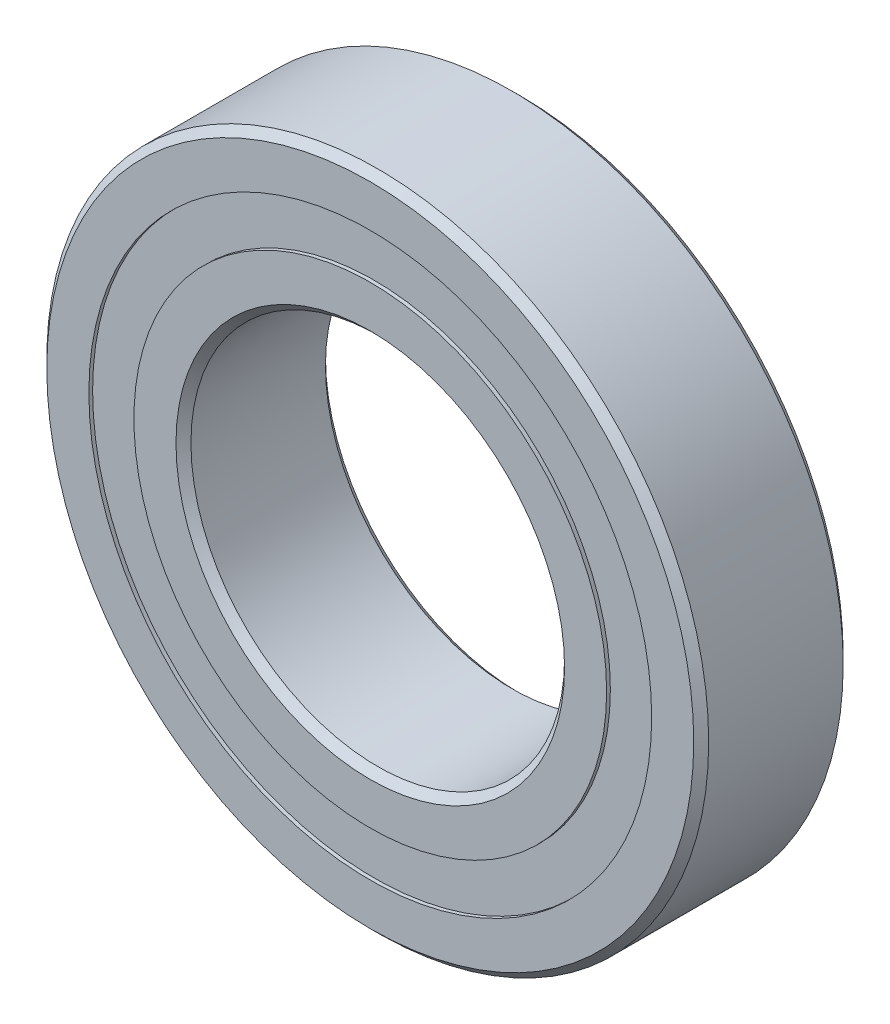
ISO-10303-21;
HEADER;
FILE_DESCRIPTION(('STEP AP214'),'2;1');
FILE_NAME('part.step','',(''),(''),'','','');
FILE_SCHEMA(('AUTOMOTIVE_DESIGN { 1 0 10303 214 1 1 1 1 }'));
ENDSEC;
DATA;
#1=APPLICATION_CONTEXT('core data for automotive mechanical design processes');
#2=APPLICATION_PROTOCOL_DEFINITION('international standard','automotive_design',2000,#1);
#3=PRODUCT_CONTEXT('',#1,'mechanical');
#4=PRODUCT('Part','Part','',(#3));
#5=PRODUCT_RELATED_PRODUCT_CATEGORY('part','',(#4));
#6=PRODUCT_DEFINITION_FORMATION('','',#4);
#7=PRODUCT_DEFINITION_CONTEXT('part definition',#1,'design');
#8=PRODUCT_DEFINITION('design','',#6,#7);
#9=PRODUCT_DEFINITION_SHAPE('','',#8);
#10=(LENGTH_UNIT() NAMED_UNIT(*) SI_UNIT(.MILLI.,.METRE.));
#11=(NAMED_UNIT(*) PLANE_ANGLE_UNIT() SI_UNIT($,.RADIAN.));
#12=(NAMED_UNIT(*) SI_UNIT($,.STERADIAN.) SOLID_ANGLE_UNIT());
#13=UNCERTAINTY_MEASURE_WITH_UNIT(LENGTH_MEASURE(1.E-05),#10,'distance_accuracy_value','');
#14=(GEOMETRIC_REPRESENTATION_CONTEXT(3) GLOBAL_UNCERTAINTY_ASSIGNED_CONTEXT((#13)) GLOBAL_UNIT_ASSIGNED_CONTEXT((#10,
#11,#12)) REPRESENTATION_CONTEXT('',''));
#15=CARTESIAN_POINT('',(0.,0.,0.));
#16=DIRECTION('',(0.,0.,1.));
#17=DIRECTION('',(1.,0.,0.));
#18=AXIS2_PLACEMENT_3D('',#15,#16,#17);
#19=CARTESIAN_POINT('',(0.,26.3596401098901,-6.65000000000001));
#20=DIRECTION('',(0.,0.,1.));
#21=DIRECTION('',(1.,0.,0.));
#22=AXIS2_PLACEMENT_3D('',#19,#20,#21);
#23=PLANE('',#22);
#24=CARTESIAN_POINT('',(0.,0.,-6.65000000000001));
#25=DIRECTION('',(0.,0.,1.));
#26=DIRECTION('',(1.,0.,0.));
#27=AXIS2_PLACEMENT_3D('',#24,#25,#26);
#28=CIRCLE('',#27,26.3596401098901);
#29=CARTESIAN_POINT('',(26.3596401098901,0.,-6.65000000000001));
#30=VERTEX_POINT('',#29);
#31=EDGE_CURVE('E60',#30,#30,#28,.T.);
#32=ORIENTED_EDGE('',*,*,#31,.F.);
#33=EDGE_LOOP('',(#32));
#34=FACE_BOUND('',#33,.T.);
#35=CARTESIAN_POINT('',(0.,0.,-6.65000000000001));
#36=DIRECTION('',(0.,0.,1.));
#37=DIRECTION('',(1.,0.,0.));
#38=AXIS2_PLACEMENT_3D('',#35,#36,#37);
#39=CIRCLE('',#38,22.1398598901099);
#40=CARTESIAN_POINT('',(22.1398598901099,0.,-6.65000000000001));
#41=VERTEX_POINT('',#40);
#42=EDGE_CURVE('E11',#41,#41,#39,.T.);
#43=ORIENTED_EDGE('',*,*,#42,.T.);
#44=EDGE_LOOP('',(#43));
#45=FACE_BOUND('',#44,.T.);
#46=ADVANCED_FACE('F46',(#34,#45),#23,.F.);
#47=CARTESIAN_POINT('',(0.,0.,7.));
#48=DIRECTION('',(0.,0.,1.));
#49=DIRECTION('',(1.,0.,0.));
#50=AXIS2_PLACEMENT_3D('',#47,#48,#49);
#51=CYLINDRICAL_SURFACE('',#50,22.1398598901099);
#52=ORIENTED_EDGE('',*,*,#42,.F.);
#53=EDGE_LOOP('',(#52));
#54=FACE_BOUND('',#53,.T.);
#55=CARTESIAN_POINT('',(0.,0.,-3.75907550090326));
#56=DIRECTION('',(0.,0.,1.));
#57=DIRECTION('',(1.,0.,0.));
#58=AXIS2_PLACEMENT_3D('',#55,#56,#57);
#59=CIRCLE('',#58,22.1398598901099);
#60=CARTESIAN_POINT('',(22.1398598901099,0.,-3.75907550090326));
#61=VERTEX_POINT('',#60);
#62=EDGE_CURVE('E52',#61,#61,#59,.T.);
#63=ORIENTED_EDGE('',*,*,#62,.T.);
#64=EDGE_LOOP('',(#63));
#65=FACE_BOUND('',#64,.T.);
#66=ADVANCED_FACE('F69',(#54,#65),#51,.F.);
#67=CARTESIAN_POINT('',(0.,26.3596401098901,-3.75907550090326));
#68=DIRECTION('',(0.,0.,-1.));
#69=DIRECTION('',(-1.,0.,0.));
#70=AXIS2_PLACEMENT_3D('',#67,#68,#69);
#71=PLANE('',#70);
#72=ORIENTED_EDGE('',*,*,#62,.F.);
#73=EDGE_LOOP('',(#72));
#74=FACE_BOUND('',#73,.T.);
#75=CARTESIAN_POINT('',(0.,0.,-3.75907550090326));
#76=DIRECTION('',(0.,0.,1.));
#77=DIRECTION('',(1.,0.,0.));
#78=AXIS2_PLACEMENT_3D('',#75,#76,#77);
#79=CIRCLE('',#78,26.3596401098901);
#80=CARTESIAN_POINT('',(26.3596401098901,0.,-3.75907550090326));
#81=VERTEX_POINT('',#80);
#82=EDGE_CURVE('E56',#81,#81,#79,.T.);
#83=ORIENTED_EDGE('',*,*,#82,.T.);
#84=EDGE_LOOP('',(#83));
#85=FACE_BOUND('',#84,.T.);
#86=ADVANCED_FACE('F73',(#74,#85),#71,.F.);
#87=CARTESIAN_POINT('',(0.,0.,7.));
#88=DIRECTION('',(0.,0.,1.));
#89=DIRECTION('',(1.,0.,0.));
#90=AXIS2_PLACEMENT_3D('',#87,#88,#89);
#91=CYLINDRICAL_SURFACE('',#90,26.3596401098901);
#92=ORIENTED_EDGE('',*,*,#82,.F.);
#93=EDGE_LOOP('',(#92));
#94=FACE_BOUND('',#93,.T.);
#95=ORIENTED_EDGE('',*,*,#31,.T.);
#96=EDGE_LOOP('',(#95));
#97=FACE_BOUND('',#96,.T.);
#98=ADVANCED_FACE('F66',(#94,#97),#91,.T.);
#99=CLOSED_SHELL('',(#46,#66,#86,#98));
#100=MANIFOLD_SOLID_BREP('B2',#99);
#101=CARTESIAN_POINT('',(0.,26.3596401098901,6.65));
#102=DIRECTION('',(0.,0.,-1.));
#103=DIRECTION('',(-1.,0.,0.));
#104=AXIS2_PLACEMENT_3D('',#101,#102,#103);
#105=PLANE('',#104);
#106=CARTESIAN_POINT('',(0.,0.,6.65));
#107=DIRECTION('',(0.,0.,1.));
#108=DIRECTION('',(1.,0.,0.));
#109=AXIS2_PLACEMENT_3D('',#106,#107,#108);
#110=CIRCLE('',#109,22.1398598901099);
#111=CARTESIAN_POINT('',(22.1398598901099,0.,6.65));
#112=VERTEX_POINT('',#111);
#113=EDGE_CURVE('E45',#112,#112,#110,.T.);
#114=ORIENTED_EDGE('',*,*,#113,.F.);
#115=EDGE_LOOP('',(#114));
#116=FACE_BOUND('',#115,.T.);
#117=CARTESIAN_POINT('',(0.,0.,6.65));
#118=DIRECTION('',(0.,0.,1.));
#119=DIRECTION('',(1.,0.,0.));
#120=AXIS2_PLACEMENT_3D('',#117,#118,#119);
#121=CIRCLE('',#120,26.3596401098901);
#122=CARTESIAN_POINT('',(26.3596401098901,0.,6.65));
#123=VERTEX_POINT('',#122);
#124=EDGE_CURVE('E128',#123,#123,#121,.T.);
#125=ORIENTED_EDGE('',*,*,#124,.T.);
#126=EDGE_LOOP('',(#125));
#127=FACE_BOUND('',#126,.T.);
#128=ADVANCED_FACE('F114',(#116,#127),#105,.F.);
#129=CARTESIAN_POINT('',(0.,0.,7.));
#130=DIRECTION('',(0.,0.,1.));
#131=DIRECTION('',(1.,0.,0.));
#132=AXIS2_PLACEMENT_3D('',#129,#130,#131);
#133=CYLINDRICAL_SURFACE('',#132,22.1398598901099);
#134=CARTESIAN_POINT('',(0.,0.,3.75907550090326));
#135=DIRECTION('',(0.,0.,1.));
#136=DIRECTION('',(1.,0.,0.));
#137=AXIS2_PLACEMENT_3D('',#134,#135,#136);
#138=CIRCLE('',#137,22.1398598901099);
#139=CARTESIAN_POINT('',(22.1398598901099,0.,3.75907550090326));
#140=VERTEX_POINT('',#139);
#141=EDGE_CURVE('E120',#140,#140,#138,.T.);
#142=ORIENTED_EDGE('',*,*,#141,.F.);
#143=EDGE_LOOP('',(#142));
#144=FACE_BOUND('',#143,.T.);
#145=ORIENTED_EDGE('',*,*,#113,.T.);
#146=EDGE_LOOP('',(#145));
#147=FACE_BOUND('',#146,.T.);
#148=ADVANCED_FACE('F143',(#144,#147),#133,.F.);
#149=CARTESIAN_POINT('',(0.,26.3596401098901,3.75907550090326));
#150=DIRECTION('',(0.,0.,1.));
#151=DIRECTION('',(1.,0.,0.));
#152=AXIS2_PLACEMENT_3D('',#149,#150,#151);
#153=PLANE('',#152);
#154=CARTESIAN_POINT('',(0.,0.,3.75907550090326));
#155=DIRECTION('',(0.,0.,1.));
#156=DIRECTION('',(1.,0.,0.));
#157=AXIS2_PLACEMENT_3D('',#154,#155,#156);
#158=CIRCLE('',#157,26.3596401098901);
#159=CARTESIAN_POINT('',(26.3596401098901,0.,3.75907550090326));
#160=VERTEX_POINT('',#159);
#161=EDGE_CURVE('E124',#160,#160,#158,.T.);
#162=ORIENTED_EDGE('',*,*,#161,.F.);
#163=EDGE_LOOP('',(#162));
#164=FACE_BOUND('',#163,.T.);
#165=ORIENTED_EDGE('',*,*,#141,.T.);
#166=EDGE_LOOP('',(#165));
#167=FACE_BOUND('',#166,.T.);
#168=ADVANCED_FACE('F138',(#164,#167),#153,.F.);
#169=CARTESIAN_POINT('',(0.,0.,7.));
#170=DIRECTION('',(0.,0.,1.));
#171=DIRECTION('',(1.,0.,0.));
#172=AXIS2_PLACEMENT_3D('',#169,#170,#171);
#173=CYLINDRICAL_SURFACE('',#172,26.3596401098901);
#174=ORIENTED_EDGE('',*,*,#124,.F.);
#175=EDGE_LOOP('',(#174));
#176=FACE_BOUND('',#175,.T.);
#177=ORIENTED_EDGE('',*,*,#161,.T.);
#178=EDGE_LOOP('',(#177));
#179=FACE_BOUND('',#178,.T.);
#180=ADVANCED_FACE('F135',(#176,#179),#173,.T.);
#181=CLOSED_SHELL('',(#128,#148,#168,#180));
#182=MANIFOLD_SOLID_BREP('B6',#181);
#183=CARTESIAN_POINT('',(-12.1248749999997,21.0008995354218,0.));
#184=DIRECTION('',(0.,0.,1.));
#185=DIRECTION('',(-0.499999999999989,0.866025403784445,0.));
#186=AXIS2_PLACEMENT_3D('',#183,#184,#185);
#187=SPHERICAL_SURFACE('',#186,3.75907550090326);
#188=CARTESIAN_POINT('',(-12.1248749999997,21.0008995354218,3.75907550090326));
#189=VERTEX_POINT('',#188);
#190=VERTEX_LOOP('',#189);
#191=FACE_BOUND('',#190,.T.);
#192=ADVANCED_FACE('F182',(#191),#187,.T.);
#193=CLOSED_SHELL('',(#192));
#194=MANIFOLD_SOLID_BREP('B40',#193);
#195=CARTESIAN_POINT('',(-21.0008995354215,12.1248750000002,0.));
#196=DIRECTION('',(0.,0.,1.));
#197=DIRECTION('',(-0.866025403784433,0.50000000000001,0.));
#198=AXIS2_PLACEMENT_3D('',#195,#196,#197);
#199=SPHERICAL_SURFACE('',#198,3.75907550090326);
#200=CARTESIAN_POINT('',(-21.0008995354215,12.1248750000002,3.75907550090326));
#201=VERTEX_POINT('',#200);
#202=VERTEX_LOOP('',#201);
#203=FACE_BOUND('',#202,.T.);
#204=ADVANCED_FACE('F203',(#203),#199,.T.);
#205=CLOSED_SHELL('',(#204));
#206=MANIFOLD_SOLID_BREP('B110',#205);
#207=CARTESIAN_POINT('',(-24.24975,2.54002648789834E-13,0.));
#208=DIRECTION('',(0.,0.,1.));
#209=DIRECTION('',(-1.,0.,0.));
#210=AXIS2_PLACEMENT_3D('',#207,#208,#209);
#211=SPHERICAL_SURFACE('',#210,3.75907550090326);
#212=CARTESIAN_POINT('',(-24.24975,2.54002648789834E-13,3.75907550090326));
#213=VERTEX_POINT('',#212);
#214=VERTEX_LOOP('',#213);
#215=FACE_BOUND('',#214,.T.);
#216=ADVANCED_FACE('F224',(#215),#211,.T.);
#217=CLOSED_SHELL('',(#216));
#218=MANIFOLD_SOLID_BREP('B178',#217);
#219=CARTESIAN_POINT('',(-21.0008995354218,-12.1248749999998,0.));
#220=DIRECTION('',(0.,0.,1.));
#221=DIRECTION('',(-0.866025403784443,-0.499999999999992,0.));
#222=AXIS2_PLACEMENT_3D('',#219,#220,#221);
#223=SPHERICAL_SURFACE('',#222,3.75907550090326);
#224=CARTESIAN_POINT('',(-21.0008995354218,-12.1248749999998,3.75907550090326));
#225=VERTEX_POINT('',#224);
#226=VERTEX_LOOP('',#225);
#227=FACE_BOUND('',#226,.T.);
#228=ADVANCED_FACE('F245',(#227),#223,.T.);
#229=CLOSED_SHELL('',(#228));
#230=MANIFOLD_SOLID_BREP('B199',#229);
#231=CARTESIAN_POINT('',(-12.1248750000002,-21.0008995354216,0.));
#232=DIRECTION('',(0.,0.,1.));
#233=DIRECTION('',(-0.500000000000007,-0.866025403784435,0.));
#234=AXIS2_PLACEMENT_3D('',#231,#232,#233);
#235=SPHERICAL_SURFACE('',#234,3.75907550090326);
#236=CARTESIAN_POINT('',(-12.1248750000002,-21.0008995354216,3.75907550090326));
#237=VERTEX_POINT('',#236);
#238=VERTEX_LOOP('',#237);
#239=FACE_BOUND('',#238,.T.);
#240=ADVANCED_FACE('F266',(#239),#235,.T.);
#241=CLOSED_SHELL('',(#240));
#242=MANIFOLD_SOLID_BREP('B220',#241);
#243=CARTESIAN_POINT('',(-1.69335099193223E-13,-24.24975,0.));
#244=DIRECTION('',(0.,0.,1.));
#245=DIRECTION('',(0.,-1.,0.));
#246=AXIS2_PLACEMENT_3D('',#243,#244,#245);
#247=SPHERICAL_SURFACE('',#246,3.75907550090326);
#248=CARTESIAN_POINT('',(-1.69335099193223E-13,-24.24975,3.75907550090326));
#249=VERTEX_POINT('',#248);
#250=VERTEX_LOOP('',#249);
#251=FACE_BOUND('',#250,.T.);
#252=ADVANCED_FACE('F287',(#251),#247,.T.);
#253=CLOSED_SHELL('',(#252));
#254=MANIFOLD_SOLID_BREP('B241',#253);
#255=CARTESIAN_POINT('',(12.1248749999999,-21.0008995354218,0.));
#256=DIRECTION('',(0.,0.,1.));
#257=DIRECTION('',(0.499999999999995,-0.866025403784442,0.));
#258=AXIS2_PLACEMENT_3D('',#255,#256,#257);
#259=SPHERICAL_SURFACE('',#258,3.75907550090326);
#260=CARTESIAN_POINT('',(12.1248749999999,-21.0008995354218,3.75907550090326));
#261=VERTEX_POINT('',#260);
#262=VERTEX_LOOP('',#261);
#263=FACE_BOUND('',#262,.T.);
#264=ADVANCED_FACE('F308',(#263),#259,.T.);
#265=CLOSED_SHELL('',(#264));
#266=MANIFOLD_SOLID_BREP('B262',#265);
#267=CARTESIAN_POINT('',(21.0008995354216,-12.1248750000001,0.));
#268=DIRECTION('',(0.,0.,1.));
#269=DIRECTION('',(0.866025403784436,-0.500000000000004,0.));
#270=AXIS2_PLACEMENT_3D('',#267,#268,#269);
#271=SPHERICAL_SURFACE('',#270,3.75907550090326);
#272=CARTESIAN_POINT('',(21.0008995354216,-12.1248750000001,3.75907550090326));
#273=VERTEX_POINT('',#272);
#274=VERTEX_LOOP('',#273);
#275=FACE_BOUND('',#274,.T.);
#276=ADVANCED_FACE('F329',(#275),#271,.T.);
#277=CLOSED_SHELL('',(#276));
#278=MANIFOLD_SOLID_BREP('B283',#277);
#279=CARTESIAN_POINT('',(24.24975,0.,0.));
#280=DIRECTION('',(0.,0.,1.));
#281=DIRECTION('',(1.,0.,0.));
#282=AXIS2_PLACEMENT_3D('',#279,#280,#281);
#283=SPHERICAL_SURFACE('',#282,3.75907550090326);
#284=CARTESIAN_POINT('',(24.24975,0.,3.75907550090326));
#285=VERTEX_POINT('',#284);
#286=VERTEX_LOOP('',#285);
#287=FACE_BOUND('',#286,.T.);
#288=ADVANCED_FACE('F350',(#287),#283,.T.);
#289=CLOSED_SHELL('',(#288));
#290=MANIFOLD_SOLID_BREP('B304',#289);
#291=CARTESIAN_POINT('',(21.0008995354217,12.124875,0.));
#292=DIRECTION('',(0.,0.,1.));
#293=DIRECTION('',(0.86602540378444,0.499999999999998,0.));
#294=AXIS2_PLACEMENT_3D('',#291,#292,#293);
#295=SPHERICAL_SURFACE('',#294,3.75907550090326);
#296=CARTESIAN_POINT('',(21.0008995354217,12.124875,3.75907550090326));
#297=VERTEX_POINT('',#296);
#298=VERTEX_LOOP('',#297);
#299=FACE_BOUND('',#298,.T.);
#300=ADVANCED_FACE('F371',(#299),#295,.T.);
#301=CLOSED_SHELL('',(#300));
#302=MANIFOLD_SOLID_BREP('B325',#301);
#303=CARTESIAN_POINT('',(12.124875,21.0008995354217,0.));
#304=DIRECTION('',(0.,0.,1.));
#305=DIRECTION('',(0.500000000000001,0.866025403784438,0.));
#306=AXIS2_PLACEMENT_3D('',#303,#304,#305);
#307=SPHERICAL_SURFACE('',#306,3.75907550090326);
#308=CARTESIAN_POINT('',(12.124875,21.0008995354217,3.75907550090326));
#309=VERTEX_POINT('',#308);
#310=VERTEX_LOOP('',#309);
#311=FACE_BOUND('',#310,.T.);
#312=ADVANCED_FACE('F392',(#311),#307,.T.);
#313=CLOSED_SHELL('',(#312));
#314=MANIFOLD_SOLID_BREP('B346',#313);
#315=CARTESIAN_POINT('',(0.,24.24975,0.));
#316=DIRECTION('',(0.,0.,1.));
#317=DIRECTION('',(0.,1.,0.));
#318=AXIS2_PLACEMENT_3D('',#315,#316,#317);
#319=SPHERICAL_SURFACE('',#318,3.75907550090326);
#320=CARTESIAN_POINT('',(0.,24.24975,3.75907550090326));
#321=VERTEX_POINT('',#320);
#322=VERTEX_LOOP('',#321);
#323=FACE_BOUND('',#322,.T.);
#324=ADVANCED_FACE('F415',(#323),#319,.T.);
#325=CLOSED_SHELL('',(#324));
#326=MANIFOLD_SOLID_BREP('B367',#325);
#327=CARTESIAN_POINT('',(0.,22.1398598901099,7.));
#328=DIRECTION('',(0.,0.,-1.));
#329=DIRECTION('',(-1.,0.,0.));
#330=AXIS2_PLACEMENT_3D('',#327,#328,#329);
#331=PLANE('',#330);
#332=CARTESIAN_POINT('',(0.,0.,7.));
#333=DIRECTION('',(0.,0.,1.));
#334=DIRECTION('',(1.,0.,0.));
#335=AXIS2_PLACEMENT_3D('',#332,#333,#334);
#336=CIRCLE('',#335,18.1995);
#337=CARTESIAN_POINT('',(18.1995,0.,7.));
#338=VERTEX_POINT('',#337);
#339=EDGE_CURVE('E463',#338,#338,#336,.T.);
#340=ORIENTED_EDGE('',*,*,#339,.F.);
#341=EDGE_LOOP('',(#340));
#342=FACE_BOUND('',#341,.T.);
#343=CARTESIAN_POINT('',(0.,0.,7.00000000000001));
#344=DIRECTION('',(0.,0.,1.));
#345=DIRECTION('',(1.,0.,0.));
#346=AXIS2_PLACEMENT_3D('',#343,#344,#345);
#347=CIRCLE('',#346,22.1398598901099);
#348=CARTESIAN_POINT('',(22.1398598901099,0.,7.00000000000001));
#349=VERTEX_POINT('',#348);
#350=EDGE_CURVE('E414',#349,#349,#347,.T.);
#351=ORIENTED_EDGE('',*,*,#350,.T.);
#352=EDGE_LOOP('',(#351));
#353=FACE_BOUND('',#352,.T.);
#354=ADVANCED_FACE('F435',(#342,#353),#331,.F.);
#355=CARTESIAN_POINT('',(0.,0.,7.));
#356=DIRECTION('',(0.,0.,1.));
#357=DIRECTION('',(1.,0.,0.));
#358=AXIS2_PLACEMENT_3D('',#355,#356,#357);
#359=CYLINDRICAL_SURFACE('',#358,22.1398598901099);
#360=ORIENTED_EDGE('',*,*,#350,.F.);
#361=EDGE_LOOP('',(#360));
#362=FACE_BOUND('',#361,.T.);
#363=CARTESIAN_POINT('',(0.,0.,3.11111111111111));
#364=DIRECTION('',(0.,0.,1.));
#365=DIRECTION('',(1.,0.,0.));
#366=AXIS2_PLACEMENT_3D('',#363,#364,#365);
#367=CIRCLE('',#366,22.1398598901099);
#368=CARTESIAN_POINT('',(22.1398598901099,0.,3.11111111111111));
#369=VERTEX_POINT('',#368);
#370=EDGE_CURVE('E441',#369,#369,#367,.T.);
#371=ORIENTED_EDGE('',*,*,#370,.T.);
#372=EDGE_LOOP('',(#371));
#373=FACE_BOUND('',#372,.T.);
#374=ADVANCED_FACE('F470',(#362,#373),#359,.T.);
#375=CARTESIAN_POINT('',(0.,0.,0.));
#376=DIRECTION('',(0.,0.,1.));
#377=DIRECTION('',(1.,0.,0.));
#378=AXIS2_PLACEMENT_3D('',#375,#376,#377);
#379=TOROIDAL_SURFACE('',#378,24.24975,3.75907550090325);
#380=ORIENTED_EDGE('',*,*,#370,.F.);
#381=EDGE_LOOP('',(#380));
#382=FACE_BOUND('',#381,.T.);
#383=CARTESIAN_POINT('',(0.,0.,-3.11111111111112));
#384=DIRECTION('',(0.,0.,1.));
#385=DIRECTION('',(1.,0.,0.));
#386=AXIS2_PLACEMENT_3D('',#383,#384,#385);
#387=CIRCLE('',#386,22.1398598901099);
#388=CARTESIAN_POINT('',(22.1398598901099,0.,-3.11111111111112));
#389=VERTEX_POINT('',#388);
#390=EDGE_CURVE('E445',#389,#389,#387,.T.);
#391=ORIENTED_EDGE('',*,*,#390,.T.);
#392=EDGE_LOOP('',(#391));
#393=FACE_BOUND('',#392,.T.);
#394=ADVANCED_FACE('F474',(#382,#393),#379,.F.);
#395=CARTESIAN_POINT('',(0.,0.,7.));
#396=DIRECTION('',(0.,0.,1.));
#397=DIRECTION('',(1.,0.,0.));
#398=AXIS2_PLACEMENT_3D('',#395,#396,#397);
#399=CYLINDRICAL_SURFACE('',#398,22.1398598901099);
#400=ORIENTED_EDGE('',*,*,#390,.F.);
#401=EDGE_LOOP('',(#400));
#402=FACE_BOUND('',#401,.T.);
#403=CARTESIAN_POINT('',(0.,0.,-7.00000000000001));
#404=DIRECTION('',(0.,0.,1.));
#405=DIRECTION('',(1.,0.,0.));
#406=AXIS2_PLACEMENT_3D('',#403,#404,#405);
#407=CIRCLE('',#406,22.1398598901099);
#408=CARTESIAN_POINT('',(22.1398598901099,0.,-7.00000000000001));
#409=VERTEX_POINT('',#408);
#410=EDGE_CURVE('E449',#409,#409,#407,.T.);
#411=ORIENTED_EDGE('',*,*,#410,.T.);
#412=EDGE_LOOP('',(#411));
#413=FACE_BOUND('',#412,.T.);
#414=ADVANCED_FACE('F479',(#402,#413),#399,.T.);
#415=CARTESIAN_POINT('',(0.,18.1995,-7.00000000000001));
#416=DIRECTION('',(0.,0.,1.));
#417=DIRECTION('',(1.,0.,0.));
#418=AXIS2_PLACEMENT_3D('',#415,#416,#417);
#419=PLANE('',#418);
#420=ORIENTED_EDGE('',*,*,#410,.F.);
#421=EDGE_LOOP('',(#420));
#422=FACE_BOUND('',#421,.T.);
#423=CARTESIAN_POINT('',(0.,0.,-7.00000000000001));
#424=DIRECTION('',(0.,0.,1.));
#425=DIRECTION('',(1.,0.,0.));
#426=AXIS2_PLACEMENT_3D('',#423,#424,#425);
#427=CIRCLE('',#426,18.1995);
#428=CARTESIAN_POINT('',(18.1995,0.,-7.00000000000001));
#429=VERTEX_POINT('',#428);
#430=EDGE_CURVE('E454',#429,#429,#427,.T.);
#431=ORIENTED_EDGE('',*,*,#430,.T.);
#432=EDGE_LOOP('',(#431));
#433=FACE_BOUND('',#432,.T.);
#434=ADVANCED_FACE('F485',(#422,#433),#419,.F.);
#435=CARTESIAN_POINT('',(0.,0.,-6.30000000000001));
#436=DIRECTION('',(0.,0.,-1.));
#437=DIRECTION('',(-1.,0.,0.));
#438=AXIS2_PLACEMENT_3D('',#435,#436,#437);
#439=CONICAL_SURFACE('',#438,17.4995,0.785398163397453);
#440=ORIENTED_EDGE('',*,*,#430,.F.);
#441=EDGE_LOOP('',(#440));
#442=FACE_BOUND('',#441,.T.);
#443=CARTESIAN_POINT('',(0.,0.,-6.30000000000001));
#444=DIRECTION('',(0.,0.,1.));
#445=DIRECTION('',(1.,0.,0.));
#446=AXIS2_PLACEMENT_3D('',#443,#444,#445);
#447=CIRCLE('',#446,17.4995);
#448=CARTESIAN_POINT('',(17.4995,0.,-6.30000000000001));
#449=VERTEX_POINT('',#448);
#450=EDGE_CURVE('E457',#449,#449,#447,.T.);
#451=ORIENTED_EDGE('',*,*,#450,.T.);
#452=EDGE_LOOP('',(#451));
#453=FACE_BOUND('',#452,.T.);
#454=ADVANCED_FACE('F489',(#442,#453),#439,.F.);
#455=CARTESIAN_POINT('',(0.,0.,7.));
#456=DIRECTION('',(0.,0.,1.));
#457=DIRECTION('',(1.,0.,0.));
#458=AXIS2_PLACEMENT_3D('',#455,#456,#457);
#459=CYLINDRICAL_SURFACE('',#458,17.4995);
#460=ORIENTED_EDGE('',*,*,#450,.F.);
#461=EDGE_LOOP('',(#460));
#462=FACE_BOUND('',#461,.T.);
#463=CARTESIAN_POINT('',(0.,0.,6.3));
#464=DIRECTION('',(0.,0.,1.));
#465=DIRECTION('',(1.,0.,0.));
#466=AXIS2_PLACEMENT_3D('',#463,#464,#465);
#467=CIRCLE('',#466,17.4995);
#468=CARTESIAN_POINT('',(17.4995,0.,6.3));
#469=VERTEX_POINT('',#468);
#470=EDGE_CURVE('E460',#469,#469,#467,.T.);
#471=ORIENTED_EDGE('',*,*,#470,.T.);
#472=EDGE_LOOP('',(#471));
#473=FACE_BOUND('',#472,.T.);
#474=ADVANCED_FACE('F493',(#462,#473),#459,.F.);
#475=CARTESIAN_POINT('',(0.,0.,7.));
#476=DIRECTION('',(0.,0.,1.));
#477=DIRECTION('',(1.,0.,0.));
#478=AXIS2_PLACEMENT_3D('',#475,#476,#477);
#479=CONICAL_SURFACE('',#478,18.1995,0.785398163397447);
#480=ORIENTED_EDGE('',*,*,#470,.F.);
#481=EDGE_LOOP('',(#480));
#482=FACE_BOUND('',#481,.T.);
#483=ORIENTED_EDGE('',*,*,#339,.T.);
#484=EDGE_LOOP('',(#483));
#485=FACE_BOUND('',#484,.T.);
#486=ADVANCED_FACE('F467',(#482,#485),#479,.F.);
#487=CLOSED_SHELL('',(#354,#374,#394,#414,#434,#454,#474,#486));
#488=MANIFOLD_SOLID_BREP('B388',#487);
#489=CARTESIAN_POINT('',(0.,0.,6.3));
#490=DIRECTION('',(0.,0.,-1.));
#491=DIRECTION('',(-1.,0.,0.));
#492=AXIS2_PLACEMENT_3D('',#489,#490,#491);
#493=CONICAL_SURFACE('',#492,31.,0.78539816339745);
#494=CARTESIAN_POINT('',(0.,0.,7.));
#495=DIRECTION('',(0.,0.,1.));
#496=DIRECTION('',(1.,0.,0.));
#497=AXIS2_PLACEMENT_3D('',#494,#495,#496);
#498=CIRCLE('',#497,30.3);
#499=CARTESIAN_POINT('',(30.3,0.,7.));
#500=VERTEX_POINT('',#499);
#501=EDGE_CURVE('E585',#500,#500,#498,.T.);
#502=ORIENTED_EDGE('',*,*,#501,.F.);
#503=EDGE_LOOP('',(#502));
#504=FACE_BOUND('',#503,.T.);
#505=CARTESIAN_POINT('',(0.,0.,6.3));
#506=DIRECTION('',(0.,0.,1.));
#507=DIRECTION('',(1.,0.,0.));
#508=AXIS2_PLACEMENT_3D('',#505,#506,#507);
#509=CIRCLE('',#508,31.);
#510=CARTESIAN_POINT('',(31.,0.,6.3));
#511=VERTEX_POINT('',#510);
#512=EDGE_CURVE('E434',#511,#511,#509,.T.);
#513=ORIENTED_EDGE('',*,*,#512,.T.);
#514=EDGE_LOOP('',(#513));
#515=FACE_BOUND('',#514,.T.);
#516=ADVANCED_FACE('F557',(#504,#515),#493,.T.);
#517=CARTESIAN_POINT('',(0.,0.,7.));
#518=DIRECTION('',(0.,0.,1.));
#519=DIRECTION('',(1.,0.,0.));
#520=AXIS2_PLACEMENT_3D('',#517,#518,#519);
#521=CYLINDRICAL_SURFACE('',#520,31.);
#522=ORIENTED_EDGE('',*,*,#512,.F.);
#523=EDGE_LOOP('',(#522));
#524=FACE_BOUND('',#523,.T.);
#525=CARTESIAN_POINT('',(0.,0.,-6.3));
#526=DIRECTION('',(0.,0.,1.));
#527=DIRECTION('',(1.,0.,0.));
#528=AXIS2_PLACEMENT_3D('',#525,#526,#527);
#529=CIRCLE('',#528,31.);
#530=CARTESIAN_POINT('',(31.,0.,-6.3));
#531=VERTEX_POINT('',#530);
#532=EDGE_CURVE('E563',#531,#531,#529,.T.);
#533=ORIENTED_EDGE('',*,*,#532,.T.);
#534=EDGE_LOOP('',(#533));
#535=FACE_BOUND('',#534,.T.);
#536=ADVANCED_FACE('F592',(#524,#535),#521,.T.);
#537=CARTESIAN_POINT('',(0.,0.,-7.00000000000001));
#538=DIRECTION('',(0.,0.,1.));
#539=DIRECTION('',(1.,0.,0.));
#540=AXIS2_PLACEMENT_3D('',#537,#538,#539);
#541=CONICAL_SURFACE('',#540,30.3,0.78539816339745);
#542=ORIENTED_EDGE('',*,*,#532,.F.);
#543=EDGE_LOOP('',(#542));
#544=FACE_BOUND('',#543,.T.);
#545=CARTESIAN_POINT('',(0.,0.,-7.00000000000001));
#546=DIRECTION('',(0.,0.,1.));
#547=DIRECTION('',(1.,0.,0.));
#548=AXIS2_PLACEMENT_3D('',#545,#546,#547);
#549=CIRCLE('',#548,30.3);
#550=CARTESIAN_POINT('',(30.3,0.,-7.00000000000001));
#551=VERTEX_POINT('',#550);
#552=EDGE_CURVE('E567',#551,#551,#549,.T.);
#553=ORIENTED_EDGE('',*,*,#552,.T.);
#554=EDGE_LOOP('',(#553));
#555=FACE_BOUND('',#554,.T.);
#556=ADVANCED_FACE('F596',(#544,#555),#541,.T.);
#557=CARTESIAN_POINT('',(0.,30.3,-7.));
#558=DIRECTION('',(0.,0.,1.));
#559=DIRECTION('',(1.,0.,0.));
#560=AXIS2_PLACEMENT_3D('',#557,#558,#559);
#561=PLANE('',#560);
#562=ORIENTED_EDGE('',*,*,#552,.F.);
#563=EDGE_LOOP('',(#562));
#564=FACE_BOUND('',#563,.T.);
#565=CARTESIAN_POINT('',(0.,0.,-7.00000000000001));
#566=DIRECTION('',(0.,0.,1.));
#567=DIRECTION('',(1.,0.,0.));
#568=AXIS2_PLACEMENT_3D('',#565,#566,#567);
#569=CIRCLE('',#568,26.3596401098901);
#570=CARTESIAN_POINT('',(26.3596401098901,0.,-7.00000000000001));
#571=VERTEX_POINT('',#570);
#572=EDGE_CURVE('E571',#571,#571,#569,.T.);
#573=ORIENTED_EDGE('',*,*,#572,.T.);
#574=EDGE_LOOP('',(#573));
#575=FACE_BOUND('',#574,.T.);
#576=ADVANCED_FACE('F601',(#564,#575),#561,.F.);
#577=CARTESIAN_POINT('',(0.,0.,7.));
#578=DIRECTION('',(0.,0.,1.));
#579=DIRECTION('',(1.,0.,0.));
#580=AXIS2_PLACEMENT_3D('',#577,#578,#579);
#581=CYLINDRICAL_SURFACE('',#580,26.3596401098901);
#582=ORIENTED_EDGE('',*,*,#572,.F.);
#583=EDGE_LOOP('',(#582));
#584=FACE_BOUND('',#583,.T.);
#585=CARTESIAN_POINT('',(0.,0.,-3.11111111111111));
#586=DIRECTION('',(0.,0.,1.));
#587=DIRECTION('',(1.,0.,0.));
#588=AXIS2_PLACEMENT_3D('',#585,#586,#587);
#589=CIRCLE('',#588,26.3596401098901);
#590=CARTESIAN_POINT('',(26.3596401098901,0.,-3.11111111111111));
#591=VERTEX_POINT('',#590);
#592=EDGE_CURVE('E576',#591,#591,#589,.T.);
#593=ORIENTED_EDGE('',*,*,#592,.T.);
#594=EDGE_LOOP('',(#593));
#595=FACE_BOUND('',#594,.T.);
#596=ADVANCED_FACE('F607',(#584,#595),#581,.F.);
#597=CARTESIAN_POINT('',(0.,0.,0.));
#598=DIRECTION('',(0.,0.,1.));
#599=DIRECTION('',(1.,0.,0.));
#600=AXIS2_PLACEMENT_3D('',#597,#598,#599);
#601=TOROIDAL_SURFACE('',#600,24.24975,3.75907550090326);
#602=ORIENTED_EDGE('',*,*,#592,.F.);
#603=EDGE_LOOP('',(#602));
#604=FACE_BOUND('',#603,.T.);
#605=CARTESIAN_POINT('',(0.,0.,3.11111111111111));
#606=DIRECTION('',(0.,0.,1.));
#607=DIRECTION('',(1.,0.,0.));
#608=AXIS2_PLACEMENT_3D('',#605,#606,#607);
#609=CIRCLE('',#608,26.3596401098901);
#610=CARTESIAN_POINT('',(26.3596401098901,0.,3.11111111111111));
#611=VERTEX_POINT('',#610);
#612=EDGE_CURVE('E579',#611,#611,#609,.T.);
#613=ORIENTED_EDGE('',*,*,#612,.T.);
#614=EDGE_LOOP('',(#613));
#615=FACE_BOUND('',#614,.T.);
#616=ADVANCED_FACE('F611',(#604,#615),#601,.F.);
#617=CARTESIAN_POINT('',(0.,0.,7.));
#618=DIRECTION('',(0.,0.,1.));
#619=DIRECTION('',(1.,0.,0.));
#620=AXIS2_PLACEMENT_3D('',#617,#618,#619);
#621=CYLINDRICAL_SURFACE('',#620,26.3596401098901);
#622=ORIENTED_EDGE('',*,*,#612,.F.);
#623=EDGE_LOOP('',(#622));
#624=FACE_BOUND('',#623,.T.);
#625=CARTESIAN_POINT('',(0.,0.,7.));
#626=DIRECTION('',(0.,0.,1.));
#627=DIRECTION('',(1.,0.,0.));
#628=AXIS2_PLACEMENT_3D('',#625,#626,#627);
#629=CIRCLE('',#628,26.3596401098901);
#630=CARTESIAN_POINT('',(26.3596401098901,0.,7.));
#631=VERTEX_POINT('',#630);
#632=EDGE_CURVE('E582',#631,#631,#629,.T.);
#633=ORIENTED_EDGE('',*,*,#632,.T.);
#634=EDGE_LOOP('',(#633));
#635=FACE_BOUND('',#634,.T.);
#636=ADVANCED_FACE('F615',(#624,#635),#621,.F.);
#637=CARTESIAN_POINT('',(0.,30.3,7.));
#638=DIRECTION('',(0.,0.,-1.));
#639=DIRECTION('',(-1.,0.,0.));
#640=AXIS2_PLACEMENT_3D('',#637,#638,#639);
#641=PLANE('',#640);
#642=ORIENTED_EDGE('',*,*,#632,.F.);
#643=EDGE_LOOP('',(#642));
#644=FACE_BOUND('',#643,.T.);
#645=ORIENTED_EDGE('',*,*,#501,.T.);
#646=EDGE_LOOP('',(#645));
#647=FACE_BOUND('',#646,.T.);
#648=ADVANCED_FACE('F589',(#644,#647),#641,.F.);
#649=CLOSED_SHELL('',(#516,#536,#556,#576,#596,#616,#636,#648));
#650=MANIFOLD_SOLID_BREP('B409',#649);
#651=ADVANCED_BREP_SHAPE_REPRESENTATION('',(#18,#100,#182,#194,#206,#218,#230,#242,#254,#266,
#278,#290,#302,#314,#326,#488,#650),#14);
#652=SHAPE_DEFINITION_REPRESENTATION(#9,#651);
ENDSEC;
END-ISO-10303-21;
